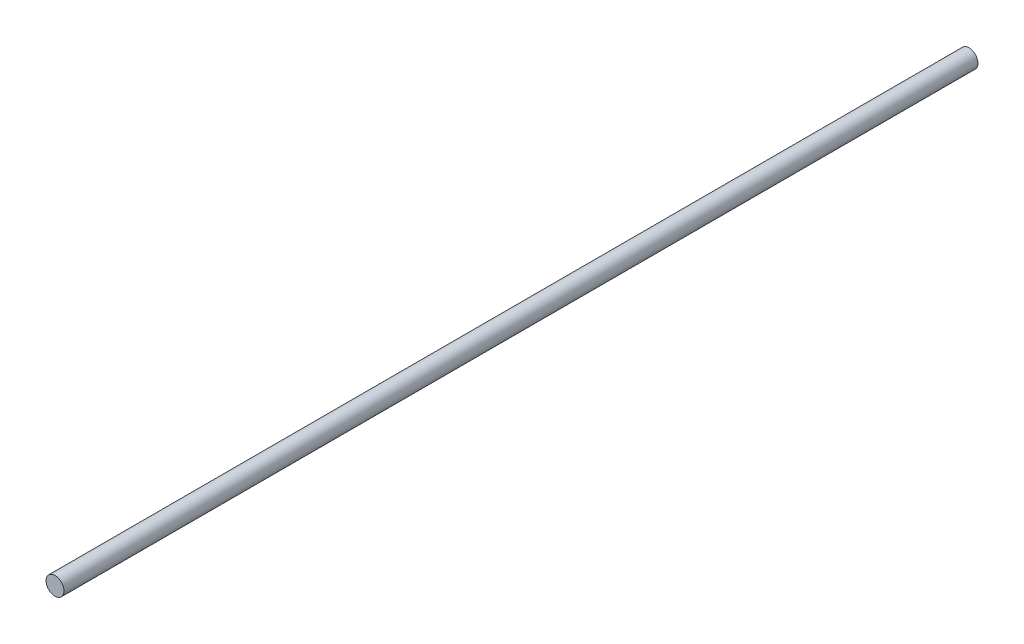
ISO-10303-21;
HEADER;
FILE_DESCRIPTION(('STEP AP214'),'2;1');
FILE_NAME('part.step','',(''),(''),'','','');
FILE_SCHEMA(('AUTOMOTIVE_DESIGN { 1 0 10303 214 1 1 1 1 }'));
ENDSEC;
DATA;
#1=APPLICATION_CONTEXT('core data for automotive mechanical design processes');
#2=APPLICATION_PROTOCOL_DEFINITION('international standard','automotive_design',2000,#1);
#3=PRODUCT_CONTEXT('',#1,'mechanical');
#4=PRODUCT('Part','Part','',(#3));
#5=PRODUCT_RELATED_PRODUCT_CATEGORY('part','',(#4));
#6=PRODUCT_DEFINITION_FORMATION('','',#4);
#7=PRODUCT_DEFINITION_CONTEXT('part definition',#1,'design');
#8=PRODUCT_DEFINITION('design','',#6,#7);
#9=PRODUCT_DEFINITION_SHAPE('','',#8);
#10=(LENGTH_UNIT() NAMED_UNIT(*) SI_UNIT(.MILLI.,.METRE.));
#11=(NAMED_UNIT(*) PLANE_ANGLE_UNIT() SI_UNIT($,.RADIAN.));
#12=(NAMED_UNIT(*) SI_UNIT($,.STERADIAN.) SOLID_ANGLE_UNIT());
#13=UNCERTAINTY_MEASURE_WITH_UNIT(LENGTH_MEASURE(1.E-05),#10,'distance_accuracy_value','');
#14=(GEOMETRIC_REPRESENTATION_CONTEXT(3) GLOBAL_UNCERTAINTY_ASSIGNED_CONTEXT((#13)) GLOBAL_UNIT_ASSIGNED_CONTEXT((#10,
#11,#12)) REPRESENTATION_CONTEXT('',''));
#15=CARTESIAN_POINT('',(0.,0.,0.));
#16=DIRECTION('',(0.,0.,1.));
#17=DIRECTION('',(1.,0.,0.));
#18=AXIS2_PLACEMENT_3D('',#15,#16,#17);
#19=CARTESIAN_POINT('',(-1.15126345606988,0.494133616116712,152.5));
#20=DIRECTION('',(0.,0.,-1.));
#21=DIRECTION('',(-1.,0.,0.));
#22=AXIS2_PLACEMENT_3D('',#19,#20,#21);
#23=CYLINDRICAL_SURFACE('',#22,1.5);
#24=CARTESIAN_POINT('',(-1.15126345606988,0.494133616116712,152.5));
#25=DIRECTION('',(0.,0.,1.));
#26=DIRECTION('',(1.,0.,0.));
#27=AXIS2_PLACEMENT_3D('',#24,#25,#26);
#28=CIRCLE('',#27,1.5);
#29=CARTESIAN_POINT('',(0.348736543930117,0.494133616116712,152.5));
#30=VERTEX_POINT('',#29);
#31=EDGE_CURVE('E10',#30,#30,#28,.T.);
#32=ORIENTED_EDGE('',*,*,#31,.F.);
#33=EDGE_LOOP('',(#32));
#34=FACE_BOUND('',#33,.T.);
#35=CARTESIAN_POINT('',(-1.15126345606988,0.494133616116712,0.));
#36=DIRECTION('',(0.,0.,1.));
#37=DIRECTION('',(1.,0.,0.));
#38=AXIS2_PLACEMENT_3D('',#35,#36,#37);
#39=CIRCLE('',#38,1.5);
#40=CARTESIAN_POINT('',(0.348736543930117,0.494133616116712,0.));
#41=VERTEX_POINT('',#40);
#42=EDGE_CURVE('E34',#41,#41,#39,.T.);
#43=ORIENTED_EDGE('',*,*,#42,.T.);
#44=EDGE_LOOP('',(#43));
#45=FACE_BOUND('',#44,.T.);
#46=ADVANCED_FACE('F31',(#34,#45),#23,.T.);
#47=CARTESIAN_POINT('',(-1.15126345606988,0.494133616116712,152.5));
#48=DIRECTION('',(0.,0.,1.));
#49=DIRECTION('',(1.,0.,0.));
#50=AXIS2_PLACEMENT_3D('',#47,#48,#49);
#51=PLANE('',#50);
#52=ORIENTED_EDGE('',*,*,#31,.T.);
#53=EDGE_LOOP('',(#52));
#54=FACE_BOUND('',#53,.T.);
#55=ADVANCED_FACE('F46',(#54),#51,.T.);
#56=CARTESIAN_POINT('',(-1.15126345606988,0.494133616116712,0.));
#57=DIRECTION('',(0.,0.,1.));
#58=DIRECTION('',(1.,0.,0.));
#59=AXIS2_PLACEMENT_3D('',#56,#57,#58);
#60=PLANE('',#59);
#61=ORIENTED_EDGE('',*,*,#42,.F.);
#62=EDGE_LOOP('',(#61));
#63=FACE_BOUND('',#62,.T.);
#64=ADVANCED_FACE('F44',(#63),#60,.F.);
#65=CLOSED_SHELL('',(#46,#55,#64));
#66=MANIFOLD_SOLID_BREP('B2',#65);
#67=ADVANCED_BREP_SHAPE_REPRESENTATION('',(#18,#66),#14);
#68=SHAPE_DEFINITION_REPRESENTATION(#9,#67);
ENDSEC;
END-ISO-10303-21;
